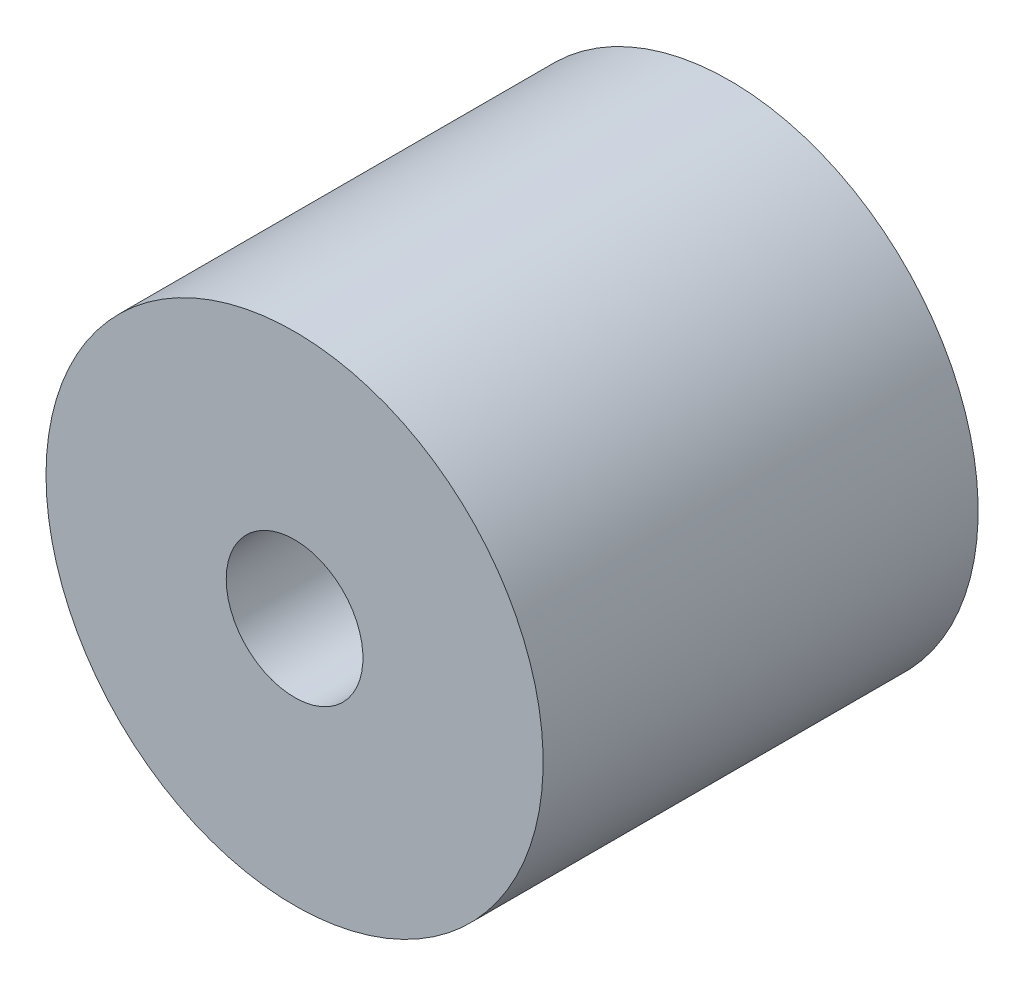
ISO-10303-21;
HEADER;
FILE_DESCRIPTION(('STEP AP214'),'2;1');
FILE_NAME('part.step','',(''),(''),'','','');
FILE_SCHEMA(('AUTOMOTIVE_DESIGN { 1 0 10303 214 1 1 1 1 }'));
ENDSEC;
DATA;
#1=APPLICATION_CONTEXT('core data for automotive mechanical design processes');
#2=APPLICATION_PROTOCOL_DEFINITION('international standard','automotive_design',2000,#1);
#3=PRODUCT_CONTEXT('',#1,'mechanical');
#4=PRODUCT('Part','Part','',(#3));
#5=PRODUCT_RELATED_PRODUCT_CATEGORY('part','',(#4));
#6=PRODUCT_DEFINITION_FORMATION('','',#4);
#7=PRODUCT_DEFINITION_CONTEXT('part definition',#1,'design');
#8=PRODUCT_DEFINITION('design','',#6,#7);
#9=PRODUCT_DEFINITION_SHAPE('','',#8);
#10=(LENGTH_UNIT() NAMED_UNIT(*) SI_UNIT(.MILLI.,.METRE.));
#11=(NAMED_UNIT(*) PLANE_ANGLE_UNIT() SI_UNIT($,.RADIAN.));
#12=(NAMED_UNIT(*) SI_UNIT($,.STERADIAN.) SOLID_ANGLE_UNIT());
#13=UNCERTAINTY_MEASURE_WITH_UNIT(LENGTH_MEASURE(1.E-05),#10,'distance_accuracy_value','');
#14=(GEOMETRIC_REPRESENTATION_CONTEXT(3) GLOBAL_UNCERTAINTY_ASSIGNED_CONTEXT((#13)) GLOBAL_UNIT_ASSIGNED_CONTEXT((#10,
#11,#12)) REPRESENTATION_CONTEXT('',''));
#15=CARTESIAN_POINT('',(0.,0.,0.));
#16=DIRECTION('',(0.,0.,1.));
#17=DIRECTION('',(1.,0.,0.));
#18=AXIS2_PLACEMENT_3D('',#15,#16,#17);
#19=CARTESIAN_POINT('',(0.,0.,10.5));
#20=DIRECTION('',(0.,0.,1.));
#21=DIRECTION('',(1.,0.,0.));
#22=AXIS2_PLACEMENT_3D('',#19,#20,#21);
#23=PLANE('',#22);
#24=CARTESIAN_POINT('',(0.,0.,10.5));
#25=DIRECTION('',(0.,0.,1.));
#26=DIRECTION('',(1.,0.,0.));
#27=AXIS2_PLACEMENT_3D('',#24,#25,#26);
#28=CIRCLE('',#27,6.);
#29=CARTESIAN_POINT('',(-6.,0.,10.5));
#30=VERTEX_POINT('',#29);
#31=EDGE_CURVE('E10',#30,#30,#28,.T.);
#32=ORIENTED_EDGE('',*,*,#31,.T.);
#33=EDGE_LOOP('',(#32));
#34=FACE_BOUND('',#33,.T.);
#35=CARTESIAN_POINT('',(0.,0.,10.5));
#36=DIRECTION('',(0.,0.,1.));
#37=DIRECTION('',(1.,0.,0.));
#38=AXIS2_PLACEMENT_3D('',#35,#36,#37);
#39=CIRCLE('',#38,1.65);
#40=CARTESIAN_POINT('',(-1.65,0.,10.5));
#41=VERTEX_POINT('',#40);
#42=EDGE_CURVE('E56',#41,#41,#39,.T.);
#43=ORIENTED_EDGE('',*,*,#42,.F.);
#44=EDGE_LOOP('',(#43));
#45=FACE_BOUND('',#44,.T.);
#46=ADVANCED_FACE('F43',(#34,#45),#23,.T.);
#47=CARTESIAN_POINT('',(0.,0.,0.));
#48=DIRECTION('',(0.,0.,1.));
#49=DIRECTION('',(1.,0.,0.));
#50=AXIS2_PLACEMENT_3D('',#47,#48,#49);
#51=PLANE('',#50);
#52=CARTESIAN_POINT('',(0.,0.,0.));
#53=DIRECTION('',(0.,0.,1.));
#54=DIRECTION('',(1.,0.,0.));
#55=AXIS2_PLACEMENT_3D('',#52,#53,#54);
#56=CIRCLE('',#55,6.);
#57=CARTESIAN_POINT('',(-6.,0.,0.));
#58=VERTEX_POINT('',#57);
#59=EDGE_CURVE('E47',#58,#58,#56,.T.);
#60=ORIENTED_EDGE('',*,*,#59,.F.);
#61=EDGE_LOOP('',(#60));
#62=FACE_BOUND('',#61,.T.);
#63=CARTESIAN_POINT('',(0.,0.,0.));
#64=DIRECTION('',(0.,0.,1.));
#65=DIRECTION('',(1.,0.,0.));
#66=AXIS2_PLACEMENT_3D('',#63,#64,#65);
#67=CIRCLE('',#66,1.65);
#68=CARTESIAN_POINT('',(-1.65,0.,0.));
#69=VERTEX_POINT('',#68);
#70=EDGE_CURVE('E58',#69,#69,#67,.T.);
#71=ORIENTED_EDGE('',*,*,#70,.T.);
#72=EDGE_LOOP('',(#71));
#73=FACE_BOUND('',#72,.T.);
#74=ADVANCED_FACE('F70',(#62,#73),#51,.F.);
#75=CARTESIAN_POINT('',(0.,0.,10.5));
#76=DIRECTION('',(0.,0.,-1.));
#77=DIRECTION('',(-1.,0.,0.));
#78=AXIS2_PLACEMENT_3D('',#75,#76,#77);
#79=CYLINDRICAL_SURFACE('',#78,6.);
#80=CARTESIAN_POINT('',(-6.,0.,10.5));
#81=CARTESIAN_POINT('',(-6.,0.,10.390625));
#82=CARTESIAN_POINT('',(-6.,0.,10.28125));
#83=CARTESIAN_POINT('',(-6.,0.,10.0625));
#84=CARTESIAN_POINT('',(-6.,0.,9.953125));
#85=CARTESIAN_POINT('',(-6.,0.,9.734375));
#86=CARTESIAN_POINT('',(-6.,0.,9.625));
#87=CARTESIAN_POINT('',(-6.,0.,9.40625));
#88=CARTESIAN_POINT('',(-6.,0.,9.296875));
#89=CARTESIAN_POINT('',(-6.,0.,9.078125));
#90=CARTESIAN_POINT('',(-6.,0.,8.96875));
#91=CARTESIAN_POINT('',(-6.,0.,8.75));
#92=CARTESIAN_POINT('',(-6.,0.,8.640625));
#93=CARTESIAN_POINT('',(-6.,0.,8.421875));
#94=CARTESIAN_POINT('',(-6.,0.,8.3125));
#95=CARTESIAN_POINT('',(-6.,0.,8.09375));
#96=CARTESIAN_POINT('',(-6.,0.,7.984375));
#97=CARTESIAN_POINT('',(-6.,0.,7.765625));
#98=CARTESIAN_POINT('',(-6.,0.,7.65625));
#99=CARTESIAN_POINT('',(-6.,0.,7.4375));
#100=CARTESIAN_POINT('',(-6.,0.,7.328125));
#101=CARTESIAN_POINT('',(-6.,0.,7.109375));
#102=CARTESIAN_POINT('',(-6.,0.,7.));
#103=CARTESIAN_POINT('',(-6.,0.,6.78125));
#104=CARTESIAN_POINT('',(-6.,0.,6.671875));
#105=CARTESIAN_POINT('',(-6.,0.,6.453125));
#106=CARTESIAN_POINT('',(-6.,0.,6.34375));
#107=CARTESIAN_POINT('',(-6.,0.,6.125));
#108=CARTESIAN_POINT('',(-6.,0.,6.015625));
#109=CARTESIAN_POINT('',(-6.,0.,5.796875));
#110=CARTESIAN_POINT('',(-6.,0.,5.6875));
#111=CARTESIAN_POINT('',(-6.,0.,5.46875));
#112=CARTESIAN_POINT('',(-6.,0.,5.359375));
#113=CARTESIAN_POINT('',(-6.,0.,5.140625));
#114=CARTESIAN_POINT('',(-6.,0.,5.03125));
#115=CARTESIAN_POINT('',(-6.,0.,4.8125));
#116=CARTESIAN_POINT('',(-6.,0.,4.703125));
#117=CARTESIAN_POINT('',(-6.,0.,4.484375));
#118=CARTESIAN_POINT('',(-6.,0.,4.375));
#119=CARTESIAN_POINT('',(-6.,0.,4.15625));
#120=CARTESIAN_POINT('',(-6.,0.,4.046875));
#121=CARTESIAN_POINT('',(-6.,0.,3.828125));
#122=CARTESIAN_POINT('',(-6.,0.,3.71875));
#123=CARTESIAN_POINT('',(-6.,0.,3.5));
#124=CARTESIAN_POINT('',(-6.,0.,3.390625));
#125=CARTESIAN_POINT('',(-6.,0.,3.171875));
#126=CARTESIAN_POINT('',(-6.,0.,3.0625));
#127=CARTESIAN_POINT('',(-6.,0.,2.84375));
#128=CARTESIAN_POINT('',(-6.,0.,2.734375));
#129=CARTESIAN_POINT('',(-6.,0.,2.515625));
#130=CARTESIAN_POINT('',(-6.,0.,2.40625));
#131=CARTESIAN_POINT('',(-6.,0.,2.1875));
#132=CARTESIAN_POINT('',(-6.,0.,2.078125));
#133=CARTESIAN_POINT('',(-6.,0.,1.859375));
#134=CARTESIAN_POINT('',(-6.,0.,1.75));
#135=CARTESIAN_POINT('',(-6.,0.,1.53125));
#136=CARTESIAN_POINT('',(-6.,0.,1.421875));
#137=CARTESIAN_POINT('',(-6.,0.,1.203125));
#138=CARTESIAN_POINT('',(-6.,0.,1.09375));
#139=CARTESIAN_POINT('',(-6.,0.,0.875000000000001));
#140=CARTESIAN_POINT('',(-6.,0.,0.765625000000001));
#141=CARTESIAN_POINT('',(-6.,0.,0.546875));
#142=CARTESIAN_POINT('',(-6.,0.,0.4375));
#143=CARTESIAN_POINT('',(-6.,0.,0.21875));
#144=CARTESIAN_POINT('',(-6.,0.,0.109375));
#145=CARTESIAN_POINT('',(-6.,0.,0.));
#146=B_SPLINE_CURVE_WITH_KNOTS('',3,(#80,#81,#82,#83,#84,#85,#86,#87,#88,#89,#90,#91,#92,#93,
#94,#95,#96,#97,#98,#99,#100,#101,#102,#103,#104,#105,#106,#107,#108,#109,#110,#111,#112,#113,
#114,#115,#116,#117,#118,#119,#120,#121,#122,#123,#124,#125,#126,#127,#128,#129,#130,#131,#132,
#133,#134,#135,#136,#137,#138,#139,#140,#141,#142,#143,#144,#145),.UNSPECIFIED.,.F.,.F.,(4,2,2,
2,2,2,2,2,2,2,2,2,2,2,2,2,2,2,2,2,2,2,2,2,2,2,2,2,2,2,2,2,4),(0.,0.328124999999999,
0.656249999999999,0.984374999999999,1.3125,1.640625,1.96875,2.296875,2.625,2.953125,3.28125,
3.609375,3.9375,4.265625,4.59375,4.921875,5.25,5.578125,5.90625,6.234375,6.5625,6.890625,
7.21875,7.546875,7.875,8.203125,8.53125,8.859375,9.1875,9.515625,9.84375,10.171875,10.5),.UNSPECIFIED.);
#147=EDGE_CURVE('BSEAM45',#30,#58,#146,.T.);
#148=ORIENTED_EDGE('',*,*,#31,.F.);
#149=ORIENTED_EDGE('',*,*,#59,.T.);
#150=ORIENTED_EDGE('',*,*,#147,.T.);
#151=ORIENTED_EDGE('',*,*,#147,.F.);
#152=EDGE_LOOP('',(#148,#150,#149,#151));
#153=FACE_BOUND('',#152,.T.);
#154=ADVANCED_FACE('F45',(#153),#79,.T.);
#155=CARTESIAN_POINT('',(0.,0.,10.5));
#156=DIRECTION('',(0.,0.,-1.));
#157=DIRECTION('',(-1.,0.,0.));
#158=AXIS2_PLACEMENT_3D('',#155,#156,#157);
#159=CYLINDRICAL_SURFACE('',#158,1.65);
#160=CARTESIAN_POINT('',(-1.65,0.,10.5));
#161=CARTESIAN_POINT('',(-1.65,0.,10.390625));
#162=CARTESIAN_POINT('',(-1.65,0.,10.28125));
#163=CARTESIAN_POINT('',(-1.65,0.,10.0625));
#164=CARTESIAN_POINT('',(-1.65,0.,9.953125));
#165=CARTESIAN_POINT('',(-1.65,0.,9.734375));
#166=CARTESIAN_POINT('',(-1.65,0.,9.625));
#167=CARTESIAN_POINT('',(-1.65,0.,9.40625));
#168=CARTESIAN_POINT('',(-1.65,0.,9.296875));
#169=CARTESIAN_POINT('',(-1.65,0.,9.078125));
#170=CARTESIAN_POINT('',(-1.65,0.,8.96875));
#171=CARTESIAN_POINT('',(-1.65,0.,8.75));
#172=CARTESIAN_POINT('',(-1.65,0.,8.640625));
#173=CARTESIAN_POINT('',(-1.65,0.,8.421875));
#174=CARTESIAN_POINT('',(-1.65,0.,8.3125));
#175=CARTESIAN_POINT('',(-1.65,0.,8.09375));
#176=CARTESIAN_POINT('',(-1.65,0.,7.984375));
#177=CARTESIAN_POINT('',(-1.65,0.,7.765625));
#178=CARTESIAN_POINT('',(-1.65,0.,7.65625));
#179=CARTESIAN_POINT('',(-1.65,0.,7.4375));
#180=CARTESIAN_POINT('',(-1.65,0.,7.328125));
#181=CARTESIAN_POINT('',(-1.65,0.,7.109375));
#182=CARTESIAN_POINT('',(-1.65,0.,7.));
#183=CARTESIAN_POINT('',(-1.65,0.,6.78125));
#184=CARTESIAN_POINT('',(-1.65,0.,6.671875));
#185=CARTESIAN_POINT('',(-1.65,0.,6.453125));
#186=CARTESIAN_POINT('',(-1.65,0.,6.34375));
#187=CARTESIAN_POINT('',(-1.65,0.,6.125));
#188=CARTESIAN_POINT('',(-1.65,0.,6.015625));
#189=CARTESIAN_POINT('',(-1.65,0.,5.796875));
#190=CARTESIAN_POINT('',(-1.65,0.,5.6875));
#191=CARTESIAN_POINT('',(-1.65,0.,5.46875));
#192=CARTESIAN_POINT('',(-1.65,0.,5.359375));
#193=CARTESIAN_POINT('',(-1.65,0.,5.140625));
#194=CARTESIAN_POINT('',(-1.65,0.,5.03125));
#195=CARTESIAN_POINT('',(-1.65,0.,4.8125));
#196=CARTESIAN_POINT('',(-1.65,0.,4.703125));
#197=CARTESIAN_POINT('',(-1.65,0.,4.484375));
#198=CARTESIAN_POINT('',(-1.65,0.,4.375));
#199=CARTESIAN_POINT('',(-1.65,0.,4.15625));
#200=CARTESIAN_POINT('',(-1.65,0.,4.046875));
#201=CARTESIAN_POINT('',(-1.65,0.,3.828125));
#202=CARTESIAN_POINT('',(-1.65,0.,3.71875));
#203=CARTESIAN_POINT('',(-1.65,0.,3.5));
#204=CARTESIAN_POINT('',(-1.65,0.,3.390625));
#205=CARTESIAN_POINT('',(-1.65,0.,3.171875));
#206=CARTESIAN_POINT('',(-1.65,0.,3.0625));
#207=CARTESIAN_POINT('',(-1.65,0.,2.84375));
#208=CARTESIAN_POINT('',(-1.65,0.,2.734375));
#209=CARTESIAN_POINT('',(-1.65,0.,2.515625));
#210=CARTESIAN_POINT('',(-1.65,0.,2.40625));
#211=CARTESIAN_POINT('',(-1.65,0.,2.1875));
#212=CARTESIAN_POINT('',(-1.65,0.,2.078125));
#213=CARTESIAN_POINT('',(-1.65,0.,1.859375));
#214=CARTESIAN_POINT('',(-1.65,0.,1.75));
#215=CARTESIAN_POINT('',(-1.65,0.,1.53125));
#216=CARTESIAN_POINT('',(-1.65,0.,1.421875));
#217=CARTESIAN_POINT('',(-1.65,0.,1.203125));
#218=CARTESIAN_POINT('',(-1.65,0.,1.09375));
#219=CARTESIAN_POINT('',(-1.65,0.,0.875000000000001));
#220=CARTESIAN_POINT('',(-1.65,0.,0.765625000000001));
#221=CARTESIAN_POINT('',(-1.65,0.,0.546875));
#222=CARTESIAN_POINT('',(-1.65,0.,0.4375));
#223=CARTESIAN_POINT('',(-1.65,0.,0.21875));
#224=CARTESIAN_POINT('',(-1.65,0.,0.109375));
#225=CARTESIAN_POINT('',(-1.65,0.,0.));
#226=B_SPLINE_CURVE_WITH_KNOTS('',3,(#160,#161,#162,#163,#164,#165,#166,#167,#168,#169,#170,
#171,#172,#173,#174,#175,#176,#177,#178,#179,#180,#181,#182,#183,#184,#185,#186,#187,#188,#189,
#190,#191,#192,#193,#194,#195,#196,#197,#198,#199,#200,#201,#202,#203,#204,#205,#206,#207,#208,
#209,#210,#211,#212,#213,#214,#215,#216,#217,#218,#219,#220,#221,#222,#223,#224,#225),
.UNSPECIFIED.,.F.,.F.,(4,2,2,2,2,2,2,2,2,2,2,2,2,2,2,2,2,2,2,2,2,2,2,2,2,2,2,2,2,2,2,2,4),(0.,
0.328124999999999,0.656249999999999,0.984374999999999,1.3125,1.640625,1.96875,2.296875,2.625,
2.953125,3.28125,3.609375,3.9375,4.265625,4.59375,4.921875,5.25,5.578125,5.90625,6.234375,
6.5625,6.890625,7.21875,7.546875,7.875,8.203125,8.53125,8.859375,9.1875,9.515625,9.84375,
10.171875,10.5),.UNSPECIFIED.);
#227=EDGE_CURVE('BSEAM66',#41,#69,#226,.T.);
#228=ORIENTED_EDGE('',*,*,#42,.T.);
#229=ORIENTED_EDGE('',*,*,#70,.F.);
#230=ORIENTED_EDGE('',*,*,#227,.T.);
#231=ORIENTED_EDGE('',*,*,#227,.F.);
#232=EDGE_LOOP('',(#228,#230,#229,#231));
#233=FACE_BOUND('',#232,.T.);
#234=ADVANCED_FACE('F66',(#233),#159,.F.);
#235=CLOSED_SHELL('',(#46,#74,#154,#234));
#236=MANIFOLD_SOLID_BREP('B2',#235);
#237=ADVANCED_BREP_SHAPE_REPRESENTATION('',(#18,#236),#14);
#238=SHAPE_DEFINITION_REPRESENTATION(#9,#237);
ENDSEC;
END-ISO-10303-21;
